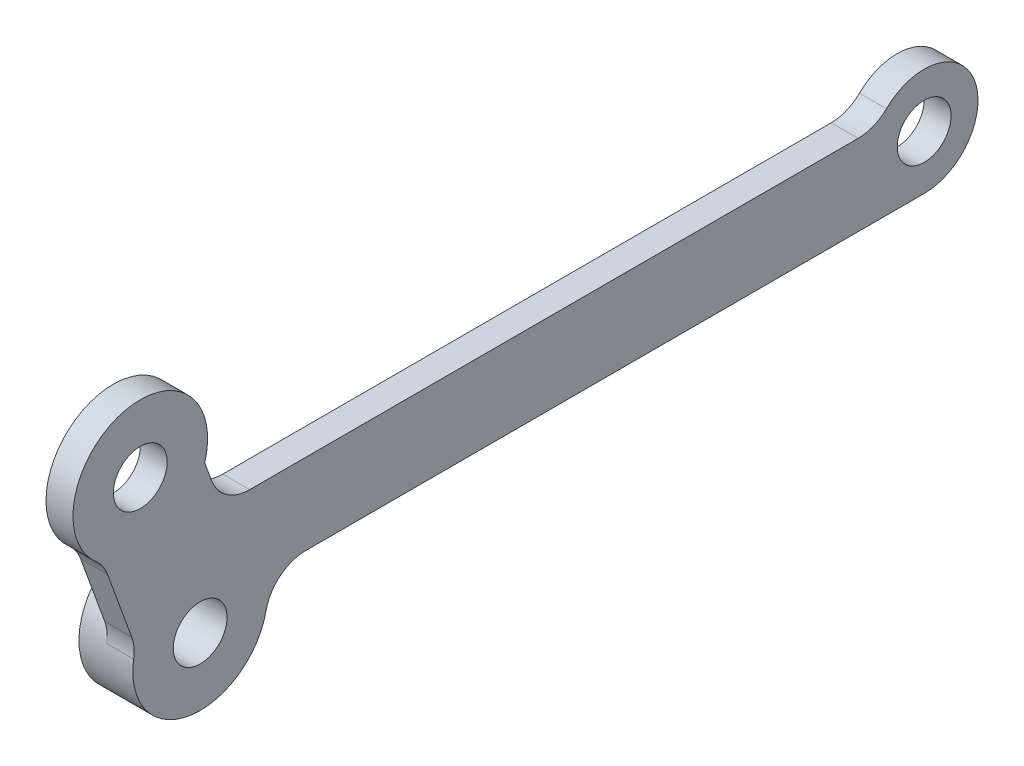
ISO-10303-21;
HEADER;
FILE_DESCRIPTION(('STEP AP214'),'2;1');
FILE_NAME('part.step','',(''),(''),'','','');
FILE_SCHEMA(('AUTOMOTIVE_DESIGN { 1 0 10303 214 1 1 1 1 }'));
ENDSEC;
DATA;
#1=APPLICATION_CONTEXT('core data for automotive mechanical design processes');
#2=APPLICATION_PROTOCOL_DEFINITION('international standard','automotive_design',2000,#1);
#3=PRODUCT_CONTEXT('',#1,'mechanical');
#4=PRODUCT('Part','Part','',(#3));
#5=PRODUCT_RELATED_PRODUCT_CATEGORY('part','',(#4));
#6=PRODUCT_DEFINITION_FORMATION('','',#4);
#7=PRODUCT_DEFINITION_CONTEXT('part definition',#1,'design');
#8=PRODUCT_DEFINITION('design','',#6,#7);
#9=PRODUCT_DEFINITION_SHAPE('','',#8);
#10=(LENGTH_UNIT() NAMED_UNIT(*) SI_UNIT(.MILLI.,.METRE.));
#11=(NAMED_UNIT(*) PLANE_ANGLE_UNIT() SI_UNIT($,.RADIAN.));
#12=(NAMED_UNIT(*) SI_UNIT($,.STERADIAN.) SOLID_ANGLE_UNIT());
#13=UNCERTAINTY_MEASURE_WITH_UNIT(LENGTH_MEASURE(1.E-05),#10,'distance_accuracy_value','');
#14=(GEOMETRIC_REPRESENTATION_CONTEXT(3) GLOBAL_UNCERTAINTY_ASSIGNED_CONTEXT((#13)) GLOBAL_UNIT_ASSIGNED_CONTEXT((#10,
#11,#12)) REPRESENTATION_CONTEXT('',''));
#15=CARTESIAN_POINT('',(0.,0.,0.));
#16=DIRECTION('',(0.,0.,1.));
#17=DIRECTION('',(1.,0.,0.));
#18=AXIS2_PLACEMENT_3D('',#15,#16,#17);
#19=CARTESIAN_POINT('',(2.,0.,0.));
#20=DIRECTION('',(0.,1.,0.));
#21=DIRECTION('',(0.,0.,1.));
#22=AXIS2_PLACEMENT_3D('',#19,#20,#21);
#23=PLANE('',#22);
#24=DIRECTION('',(0.,0.,-1.));
#25=VECTOR('',#24,1.);
#26=CARTESIAN_POINT('',(2.,0.,0.));
#27=LINE('',#26,#25);
#28=CARTESIAN_POINT('',(2.,0.,-2.10062261462914));
#29=VERTEX_POINT('',#28);
#30=CARTESIAN_POINT('',(2.,0.,-47.2848419200309));
#31=VERTEX_POINT('',#30);
#32=EDGE_CURVE('E237',#29,#31,#27,.T.);
#33=ORIENTED_EDGE('',*,*,#32,.T.);
#34=DIRECTION('',(-1.,0.,0.));
#35=VECTOR('',#34,1.);
#36=CARTESIAN_POINT('',(2.,0.,-47.2848419200309));
#37=LINE('',#36,#35);
#38=CARTESIAN_POINT('',(0.,0.,-47.2848419200309));
#39=VERTEX_POINT('',#38);
#40=EDGE_CURVE('E271',#31,#39,#37,.T.);
#41=ORIENTED_EDGE('',*,*,#40,.T.);
#42=DIRECTION('',(0.,0.,-1.));
#43=VECTOR('',#42,1.);
#44=CARTESIAN_POINT('',(0.,0.,0.));
#45=LINE('',#44,#43);
#46=CARTESIAN_POINT('',(0.,0.,-2.10062261462914));
#47=VERTEX_POINT('',#46);
#48=EDGE_CURVE('E267',#47,#39,#45,.T.);
#49=ORIENTED_EDGE('',*,*,#48,.F.);
#50=DIRECTION('',(-1.,0.,0.));
#51=VECTOR('',#50,1.);
#52=CARTESIAN_POINT('',(2.,0.,-2.10062261462914));
#53=LINE('',#52,#51);
#54=EDGE_CURVE('E247',#47,#29,#53,.F.);
#55=ORIENTED_EDGE('',*,*,#54,.T.);
#56=EDGE_LOOP('',(#33,#41,#49,#55));
#57=FACE_BOUND('',#56,.T.);
#58=ADVANCED_FACE('F134',(#57),#23,.T.);
#59=CARTESIAN_POINT('',(2.,-6.,0.));
#60=DIRECTION('',(0.,1.,0.));
#61=DIRECTION('',(0.,0.,1.));
#62=AXIS2_PLACEMENT_3D('',#59,#60,#61);
#63=PLANE('',#62);
#64=DIRECTION('',(0.,0.,-1.));
#65=VECTOR('',#64,1.);
#66=CARTESIAN_POINT('',(2.,-6.,0.));
#67=LINE('',#66,#65);
#68=CARTESIAN_POINT('',(2.,-6.,-6.25683481788682));
#69=VERTEX_POINT('',#68);
#70=CARTESIAN_POINT('',(2.,-6.,-52.1838214055972));
#71=VERTEX_POINT('',#70);
#72=EDGE_CURVE('E223',#69,#71,#67,.T.);
#73=ORIENTED_EDGE('',*,*,#72,.F.);
#74=DIRECTION('',(1.,0.,0.));
#75=VECTOR('',#74,1.);
#76=CARTESIAN_POINT('',(0.,-6.,-6.25683481788682));
#77=LINE('',#76,#75);
#78=CARTESIAN_POINT('',(0.,-6.,-6.25683481788682));
#79=VERTEX_POINT('',#78);
#80=EDGE_CURVE('E294',#69,#79,#77,.F.);
#81=ORIENTED_EDGE('',*,*,#80,.T.);
#82=DIRECTION('',(0.,0.,-1.));
#83=VECTOR('',#82,1.);
#84=CARTESIAN_POINT('',(0.,-6.,0.));
#85=LINE('',#84,#83);
#86=CARTESIAN_POINT('',(0.,-6.,-52.1838214055972));
#87=VERTEX_POINT('',#86);
#88=EDGE_CURVE('E242',#79,#87,#85,.T.);
#89=ORIENTED_EDGE('',*,*,#88,.T.);
#90=DIRECTION('',(-1.,0.,0.));
#91=VECTOR('',#90,1.);
#92=CARTESIAN_POINT('',(2.,-6.,-52.1838214055972));
#93=LINE('',#92,#91);
#94=EDGE_CURVE('E236',#71,#87,#93,.T.);
#95=ORIENTED_EDGE('',*,*,#94,.F.);
#96=EDGE_LOOP('',(#73,#81,#89,#95));
#97=FACE_BOUND('',#96,.T.);
#98=ADVANCED_FACE('F240',(#97),#63,.F.);
#99=CARTESIAN_POINT('',(0.,0.,0.));
#100=DIRECTION('',(1.,0.,0.));
#101=DIRECTION('',(0.,0.,-1.));
#102=AXIS2_PLACEMENT_3D('',#99,#100,#101);
#103=PLANE('',#102);
#104=CARTESIAN_POINT('',(0.,4.84792349691415,6.0212109407801));
#105=DIRECTION('',(1.,0.,0.));
#106=DIRECTION('',(0.,0.,-1.));
#107=AXIS2_PLACEMENT_3D('',#104,#105,#106);
#108=CIRCLE('',#107,2.);
#109=CARTESIAN_POINT('',(0.,4.84792349691415,4.0212109407801));
#110=VERTEX_POINT('',#109);
#111=EDGE_CURVE('E366',#110,#110,#108,.F.);
#112=ORIENTED_EDGE('',*,*,#111,.F.);
#113=EDGE_LOOP('',(#112));
#114=FACE_BOUND('',#113,.T.);
#115=CARTESIAN_POINT('',(0.,-2.,-52.1838214055972));
#116=DIRECTION('',(1.,0.,0.));
#117=DIRECTION('',(0.,0.,-1.));
#118=AXIS2_PLACEMENT_3D('',#115,#116,#117);
#119=CIRCLE('',#118,2.);
#120=CARTESIAN_POINT('',(0.,-2.,-54.1838214055972));
#121=VERTEX_POINT('',#120);
#122=EDGE_CURVE('E373',#121,#121,#119,.F.);
#123=ORIENTED_EDGE('',*,*,#122,.F.);
#124=EDGE_LOOP('',(#123));
#125=FACE_BOUND('',#124,.T.);
#126=ORIENTED_EDGE('',*,*,#88,.F.);
#127=CARTESIAN_POINT('',(0.,-9.,-6.25683481788682));
#128=DIRECTION('',(1.,0.,0.));
#129=DIRECTION('',(0.,0.,-1.));
#130=AXIS2_PLACEMENT_3D('',#127,#128,#129);
#131=CIRCLE('',#130,3.);
#132=CARTESIAN_POINT('',(0.,-8.3880302149885,-3.31991585709935));
#133=VERTEX_POINT('',#132);
#134=EDGE_CURVE('E318',#79,#133,#131,.T.);
#135=ORIENTED_EDGE('',*,*,#134,.T.);
#136=CARTESIAN_POINT('',(0.,-7.36808057330267,1.57494907754644));
#137=DIRECTION('',(1.,0.,0.));
#138=DIRECTION('',(0.,0.,-1.));
#139=AXIS2_PLACEMENT_3D('',#136,#137,#138);
#140=CIRCLE('',#139,4.99999999999999);
#141=CARTESIAN_POINT('',(0.,-6.58978503106634,6.51400324296464));
#142=VERTEX_POINT('',#141);
#143=EDGE_CURVE('E363',#133,#142,#140,.T.);
#144=ORIENTED_EDGE('',*,*,#143,.T.);
#145=CARTESIAN_POINT('',(0.,-6.12280770572454,9.47743574221558));
#146=DIRECTION('',(1.,0.,0.));
#147=DIRECTION('',(0.,0.,-1.));
#148=AXIS2_PLACEMENT_3D('',#145,#146,#147);
#149=CIRCLE('',#148,3.);
#150=CARTESIAN_POINT('',(0.,-5.09674727574754,6.65835787985785));
#151=VERTEX_POINT('',#150);
#152=EDGE_CURVE('E306',#142,#151,#149,.T.);
#153=ORIENTED_EDGE('',*,*,#152,.T.);
#154=DIRECTION('',(0.,-0.939692620785909,-0.342020143325666));
#155=VECTOR('',#154,1.);
#156=CARTESIAN_POINT('',(0.,3.47984292361148,9.77998142392374));
#157=LINE('',#156,#155);
#158=CARTESIAN_POINT('',(0.,-0.159570947246327,8.45534310475597));
#159=VERTEX_POINT('',#158);
#160=EDGE_CURVE('E343',#159,#151,#157,.T.);
#161=ORIENTED_EDGE('',*,*,#160,.F.);
#162=CARTESIAN_POINT('',(0.,-1.18563137722333,11.2744209671137));
#163=DIRECTION('',(1.,0.,0.));
#164=DIRECTION('',(0.,0.,-1.));
#165=AXIS2_PLACEMENT_3D('',#162,#163,#164);
#166=CIRCLE('',#165,3.);
#167=CARTESIAN_POINT('',(0.,1.07695170057823,9.30446720723859));
#168=VERTEX_POINT('',#167);
#169=EDGE_CURVE('E312',#159,#168,#166,.T.);
#170=ORIENTED_EDGE('',*,*,#169,.T.);
#171=CARTESIAN_POINT('',(0.,4.84792349691415,6.0212109407801));
#172=DIRECTION('',(1.,0.,0.));
#173=DIRECTION('',(0.,0.,-1.));
#174=AXIS2_PLACEMENT_3D('',#171,#172,#173);
#175=CIRCLE('',#174,4.99999999999999);
#176=CARTESIAN_POINT('',(0.,3.3969262078591,1.23638002765947));
#177=VERTEX_POINT('',#176);
#178=EDGE_CURVE('E348',#177,#168,#175,.T.);
#179=ORIENTED_EDGE('',*,*,#178,.F.);
#180=DIRECTION('',(0.,-0.939692620785909,-0.342020143325667));
#181=VECTOR('',#180,1.);
#182=CARTESIAN_POINT('',(0.,6.21600407021682,2.26244045763647));
#183=LINE('',#182,#181);
#184=CARTESIAN_POINT('',(0.,1.973939570023,0.71845524772859));
#185=VERTEX_POINT('',#184);
#186=EDGE_CURVE('E258',#177,#185,#183,.T.);
#187=ORIENTED_EDGE('',*,*,#186,.T.);
#188=CARTESIAN_POINT('',(0.,3.,-2.10062261462914));
#189=DIRECTION('',(1.,0.,0.));
#190=DIRECTION('',(0.,0.,-1.));
#191=AXIS2_PLACEMENT_3D('',#188,#189,#190);
#192=CIRCLE('',#191,3.);
#193=EDGE_CURVE('E143',#185,#47,#192,.T.);
#194=ORIENTED_EDGE('',*,*,#193,.T.);
#195=ORIENTED_EDGE('',*,*,#48,.T.);
#196=CARTESIAN_POINT('',(0.,3.,-47.2848419200309));
#197=DIRECTION('',(1.,0.,0.));
#198=DIRECTION('',(0.,0.,-1.));
#199=AXIS2_PLACEMENT_3D('',#196,#197,#198);
#200=CIRCLE('',#199,3.);
#201=CARTESIAN_POINT('',(0.,0.857142857142855,-49.3844045567022));
#202=VERTEX_POINT('',#201);
#203=EDGE_CURVE('E300',#39,#202,#200,.T.);
#204=ORIENTED_EDGE('',*,*,#203,.T.);
#205=CARTESIAN_POINT('',(0.,-2.,-52.1838214055972));
#206=DIRECTION('',(1.,0.,0.));
#207=DIRECTION('',(0.,0.,-1.));
#208=AXIS2_PLACEMENT_3D('',#205,#206,#207);
#209=CIRCLE('',#208,3.99999999999999);
#210=EDGE_CURVE('E254',#87,#202,#209,.T.);
#211=ORIENTED_EDGE('',*,*,#210,.F.);
#212=EDGE_LOOP('',(#126,#135,#144,#153,#161,#170,#179,#187,#194,#195,#204,#211));
#213=FACE_BOUND('',#212,.T.);
#214=ADVANCED_FACE('F328',(#114,#125,#213),#103,.F.);
#215=CARTESIAN_POINT('',(2.,0.,0.));
#216=DIRECTION('',(1.,0.,0.));
#217=DIRECTION('',(0.,0.,-1.));
#218=AXIS2_PLACEMENT_3D('',#215,#216,#217);
#219=PLANE('',#218);
#220=CARTESIAN_POINT('',(2.,4.84792349691415,6.0212109407801));
#221=DIRECTION('',(1.,0.,0.));
#222=DIRECTION('',(0.,0.,-1.));
#223=AXIS2_PLACEMENT_3D('',#220,#221,#222);
#224=CIRCLE('',#223,2.);
#225=CARTESIAN_POINT('',(2.,4.84792349691415,4.0212109407801));
#226=VERTEX_POINT('',#225);
#227=EDGE_CURVE('E377',#226,#226,#224,.T.);
#228=ORIENTED_EDGE('',*,*,#227,.F.);
#229=EDGE_LOOP('',(#228));
#230=FACE_BOUND('',#229,.T.);
#231=CARTESIAN_POINT('',(2.,-7.36808057330267,1.57494907754644));
#232=DIRECTION('',(1.,0.,0.));
#233=DIRECTION('',(0.,0.,-1.));
#234=AXIS2_PLACEMENT_3D('',#231,#232,#233);
#235=CIRCLE('',#234,2.);
#236=CARTESIAN_POINT('',(2.,-7.36808057330267,-0.425050922453565));
#237=VERTEX_POINT('',#236);
#238=EDGE_CURVE('E382',#237,#237,#235,.T.);
#239=ORIENTED_EDGE('',*,*,#238,.F.);
#240=EDGE_LOOP('',(#239));
#241=FACE_BOUND('',#240,.T.);
#242=CARTESIAN_POINT('',(2.,-2.,-52.1838214055972));
#243=DIRECTION('',(1.,0.,0.));
#244=DIRECTION('',(0.,0.,-1.));
#245=AXIS2_PLACEMENT_3D('',#242,#243,#244);
#246=CIRCLE('',#245,2.);
#247=CARTESIAN_POINT('',(2.,-2.,-54.1838214055972));
#248=VERTEX_POINT('',#247);
#249=EDGE_CURVE('E378',#248,#248,#246,.T.);
#250=ORIENTED_EDGE('',*,*,#249,.F.);
#251=EDGE_LOOP('',(#250));
#252=FACE_BOUND('',#251,.T.);
#253=CARTESIAN_POINT('',(2.,-7.36808057330267,1.57494907754644));
#254=DIRECTION('',(1.,0.,0.));
#255=DIRECTION('',(0.,0.,-1.));
#256=AXIS2_PLACEMENT_3D('',#253,#254,#255);
#257=CIRCLE('',#256,4.99999999999999);
#258=CARTESIAN_POINT('',(2.,-6.58978503106634,6.51400324296464));
#259=VERTEX_POINT('',#258);
#260=CARTESIAN_POINT('',(2.,-8.3880302149885,-3.31991585709935));
#261=VERTEX_POINT('',#260);
#262=EDGE_CURVE('E253',#259,#261,#257,.T.);
#263=ORIENTED_EDGE('',*,*,#262,.T.);
#264=CARTESIAN_POINT('',(2.,-9.,-6.25683481788682));
#265=DIRECTION('',(1.,0.,0.));
#266=DIRECTION('',(0.,0.,-1.));
#267=AXIS2_PLACEMENT_3D('',#264,#265,#266);
#268=CIRCLE('',#267,3.);
#269=EDGE_CURVE('E231',#261,#69,#268,.F.);
#270=ORIENTED_EDGE('',*,*,#269,.T.);
#271=ORIENTED_EDGE('',*,*,#72,.T.);
#272=CARTESIAN_POINT('',(2.,-2.,-52.1838214055972));
#273=DIRECTION('',(1.,0.,0.));
#274=DIRECTION('',(0.,0.,-1.));
#275=AXIS2_PLACEMENT_3D('',#272,#273,#274);
#276=CIRCLE('',#275,3.99999999999999);
#277=CARTESIAN_POINT('',(2.,0.857142857142855,-49.3844045567022));
#278=VERTEX_POINT('',#277);
#279=EDGE_CURVE('E228',#71,#278,#276,.T.);
#280=ORIENTED_EDGE('',*,*,#279,.T.);
#281=CARTESIAN_POINT('',(2.,3.,-47.2848419200309));
#282=DIRECTION('',(1.,0.,0.));
#283=DIRECTION('',(0.,0.,-1.));
#284=AXIS2_PLACEMENT_3D('',#281,#282,#283);
#285=CIRCLE('',#284,3.);
#286=EDGE_CURVE('E303',#278,#31,#285,.F.);
#287=ORIENTED_EDGE('',*,*,#286,.T.);
#288=ORIENTED_EDGE('',*,*,#32,.F.);
#289=CARTESIAN_POINT('',(2.,3.,-2.10062261462914));
#290=DIRECTION('',(1.,0.,0.));
#291=DIRECTION('',(0.,0.,-1.));
#292=AXIS2_PLACEMENT_3D('',#289,#290,#291);
#293=CIRCLE('',#292,3.);
#294=CARTESIAN_POINT('',(2.,1.973939570023,0.71845524772859));
#295=VERTEX_POINT('',#294);
#296=EDGE_CURVE('E12',#29,#295,#293,.F.);
#297=ORIENTED_EDGE('',*,*,#296,.T.);
#298=DIRECTION('',(0.,-0.939692620785909,-0.342020143325667));
#299=VECTOR('',#298,1.);
#300=CARTESIAN_POINT('',(2.,6.21600407021682,2.26244045763647));
#301=LINE('',#300,#299);
#302=CARTESIAN_POINT('',(2.,3.3969262078591,1.23638002765947));
#303=VERTEX_POINT('',#302);
#304=EDGE_CURVE('E338',#303,#295,#301,.T.);
#305=ORIENTED_EDGE('',*,*,#304,.F.);
#306=CARTESIAN_POINT('',(2.,4.84792349691415,6.0212109407801));
#307=DIRECTION('',(1.,0.,0.));
#308=DIRECTION('',(0.,0.,-1.));
#309=AXIS2_PLACEMENT_3D('',#306,#307,#308);
#310=CIRCLE('',#309,4.99999999999999);
#311=CARTESIAN_POINT('',(2.,1.07695170057823,9.30446720723859));
#312=VERTEX_POINT('',#311);
#313=EDGE_CURVE('E268',#303,#312,#310,.T.);
#314=ORIENTED_EDGE('',*,*,#313,.T.);
#315=CARTESIAN_POINT('',(2.,-1.18563137722333,11.2744209671137));
#316=DIRECTION('',(1.,0.,0.));
#317=DIRECTION('',(0.,0.,-1.));
#318=AXIS2_PLACEMENT_3D('',#315,#316,#317);
#319=CIRCLE('',#318,3.);
#320=CARTESIAN_POINT('',(2.,-0.159570947246327,8.45534310475597));
#321=VERTEX_POINT('',#320);
#322=EDGE_CURVE('E315',#312,#321,#319,.F.);
#323=ORIENTED_EDGE('',*,*,#322,.T.);
#324=DIRECTION('',(0.,-0.939692620785909,-0.342020143325666));
#325=VECTOR('',#324,1.);
#326=CARTESIAN_POINT('',(2.,3.47984292361148,9.77998142392374));
#327=LINE('',#326,#325);
#328=CARTESIAN_POINT('',(2.,-5.09674727574754,6.65835787985785));
#329=VERTEX_POINT('',#328);
#330=EDGE_CURVE('E342',#321,#329,#327,.T.);
#331=ORIENTED_EDGE('',*,*,#330,.T.);
#332=CARTESIAN_POINT('',(2.,-6.12280770572454,9.47743574221558));
#333=DIRECTION('',(1.,0.,0.));
#334=DIRECTION('',(0.,0.,-1.));
#335=AXIS2_PLACEMENT_3D('',#332,#333,#334);
#336=CIRCLE('',#335,3.);
#337=EDGE_CURVE('E309',#329,#259,#336,.F.);
#338=ORIENTED_EDGE('',*,*,#337,.T.);
#339=EDGE_LOOP('',(#263,#270,#271,#280,#287,#288,#297,#305,#314,#323,#331,#338));
#340=FACE_BOUND('',#339,.T.);
#341=ADVANCED_FACE('F226',(#230,#241,#252,#340),#219,.T.);
#342=CARTESIAN_POINT('',(2.,-2.,-52.1838214055972));
#343=DIRECTION('',(-1.,0.,0.));
#344=DIRECTION('',(0.,0.,1.));
#345=AXIS2_PLACEMENT_3D('',#342,#343,#344);
#346=CYLINDRICAL_SURFACE('',#345,3.99999999999999);
#347=ORIENTED_EDGE('',*,*,#210,.T.);
#348=DIRECTION('',(-1.,0.,0.));
#349=VECTOR('',#348,1.);
#350=CARTESIAN_POINT('',(2.,0.857142857142855,-49.3844045567022));
#351=LINE('',#350,#349);
#352=EDGE_CURVE('E251',#202,#278,#351,.F.);
#353=ORIENTED_EDGE('',*,*,#352,.T.);
#354=ORIENTED_EDGE('',*,*,#279,.F.);
#355=ORIENTED_EDGE('',*,*,#94,.T.);
#356=EDGE_LOOP('',(#347,#353,#354,#355));
#357=FACE_BOUND('',#356,.T.);
#358=ADVANCED_FACE('F249',(#357),#346,.T.);
#359=CARTESIAN_POINT('',(2.,4.84792349691415,6.0212109407801));
#360=DIRECTION('',(-1.,0.,0.));
#361=DIRECTION('',(0.,0.,1.));
#362=AXIS2_PLACEMENT_3D('',#359,#360,#361);
#363=CYLINDRICAL_SURFACE('',#362,4.99999999999999);
#364=ORIENTED_EDGE('',*,*,#178,.T.);
#365=DIRECTION('',(-1.,0.,0.));
#366=VECTOR('',#365,1.);
#367=CARTESIAN_POINT('',(2.,1.07695170057823,9.30446720723859));
#368=LINE('',#367,#366);
#369=EDGE_CURVE('E291',#168,#312,#368,.F.);
#370=ORIENTED_EDGE('',*,*,#369,.T.);
#371=ORIENTED_EDGE('',*,*,#313,.F.);
#372=DIRECTION('',(-1.,0.,0.));
#373=VECTOR('',#372,1.);
#374=CARTESIAN_POINT('',(2.,3.3969262078591,1.23638002765947));
#375=LINE('',#374,#373);
#376=EDGE_CURVE('E264',#303,#177,#375,.T.);
#377=ORIENTED_EDGE('',*,*,#376,.T.);
#378=EDGE_LOOP('',(#364,#370,#371,#377));
#379=FACE_BOUND('',#378,.T.);
#380=ADVANCED_FACE('F424',(#379),#363,.T.);
#381=CARTESIAN_POINT('',(2.,6.21600407021682,2.26244045763647));
#382=DIRECTION('',(0.,0.342020143325667,-0.939692620785909));
#383=DIRECTION('',(0.,0.939692620785909,0.342020143325667));
#384=AXIS2_PLACEMENT_3D('',#381,#382,#383);
#385=PLANE('',#384);
#386=ORIENTED_EDGE('',*,*,#304,.T.);
#387=DIRECTION('',(-1.,0.,0.));
#388=VECTOR('',#387,1.);
#389=CARTESIAN_POINT('',(0.,1.973939570023,0.718455247728589));
#390=LINE('',#389,#388);
#391=EDGE_CURVE('E297',#295,#185,#390,.T.);
#392=ORIENTED_EDGE('',*,*,#391,.T.);
#393=ORIENTED_EDGE('',*,*,#186,.F.);
#394=ORIENTED_EDGE('',*,*,#376,.F.);
#395=EDGE_LOOP('',(#386,#392,#393,#394));
#396=FACE_BOUND('',#395,.T.);
#397=ADVANCED_FACE('F337',(#396),#385,.T.);
#398=CARTESIAN_POINT('',(2.,3.47984292361148,9.77998142392374));
#399=DIRECTION('',(0.,0.342020143325666,-0.939692620785909));
#400=DIRECTION('',(0.,0.93969262078591,0.342020143325666));
#401=AXIS2_PLACEMENT_3D('',#398,#399,#400);
#402=PLANE('',#401);
#403=ORIENTED_EDGE('',*,*,#160,.T.);
#404=DIRECTION('',(1.,0.,0.));
#405=VECTOR('',#404,1.);
#406=CARTESIAN_POINT('',(2.,-5.09674727574754,6.65835787985785));
#407=LINE('',#406,#405);
#408=EDGE_CURVE('E288',#151,#329,#407,.T.);
#409=ORIENTED_EDGE('',*,*,#408,.T.);
#410=ORIENTED_EDGE('',*,*,#330,.F.);
#411=DIRECTION('',(1.,0.,0.));
#412=VECTOR('',#411,1.);
#413=CARTESIAN_POINT('',(0.,-0.159570947246327,8.45534310475597));
#414=LINE('',#413,#412);
#415=EDGE_CURVE('E284',#321,#159,#414,.F.);
#416=ORIENTED_EDGE('',*,*,#415,.T.);
#417=EDGE_LOOP('',(#403,#409,#410,#416));
#418=FACE_BOUND('',#417,.T.);
#419=ADVANCED_FACE('F428',(#418),#402,.F.);
#420=CARTESIAN_POINT('',(2.,-7.36808057330267,1.57494907754644));
#421=DIRECTION('',(-1.,0.,0.));
#422=DIRECTION('',(0.,0.,1.));
#423=AXIS2_PLACEMENT_3D('',#420,#421,#422);
#424=CYLINDRICAL_SURFACE('',#423,4.99999999999999);
#425=ORIENTED_EDGE('',*,*,#262,.F.);
#426=DIRECTION('',(-1.,0.,0.));
#427=VECTOR('',#426,1.);
#428=CARTESIAN_POINT('',(2.,-6.58978503106634,6.51400324296465));
#429=LINE('',#428,#427);
#430=EDGE_CURVE('E280',#259,#142,#429,.T.);
#431=ORIENTED_EDGE('',*,*,#430,.T.);
#432=ORIENTED_EDGE('',*,*,#143,.F.);
#433=DIRECTION('',(-1.,0.,0.));
#434=VECTOR('',#433,1.);
#435=CARTESIAN_POINT('',(2.,-8.3880302149885,-3.31991585709935));
#436=LINE('',#435,#434);
#437=EDGE_CURVE('E277',#133,#261,#436,.F.);
#438=ORIENTED_EDGE('',*,*,#437,.T.);
#439=EDGE_LOOP('',(#425,#431,#432,#438));
#440=FACE_BOUND('',#439,.T.);
#441=CARTESIAN_POINT('',(-2.,-7.36808057330267,1.57494907754644));
#442=DIRECTION('',(1.,0.,0.));
#443=DIRECTION('',(0.,0.,-1.));
#444=AXIS2_PLACEMENT_3D('',#441,#442,#443);
#445=CIRCLE('',#444,4.99999999999999);
#446=CARTESIAN_POINT('',(-2.,-7.36808057330267,-3.42505092245356));
#447=VERTEX_POINT('',#446);
#448=EDGE_CURVE('E260',#447,#447,#445,.T.);
#449=ORIENTED_EDGE('',*,*,#448,.T.);
#450=EDGE_LOOP('',(#449));
#451=FACE_BOUND('',#450,.T.);
#452=ADVANCED_FACE('F431',(#440,#451),#424,.T.);
#453=CARTESIAN_POINT('',(-2.,-7.36808057330267,1.57494907754644));
#454=DIRECTION('',(1.,0.,0.));
#455=DIRECTION('',(0.,0.,-1.));
#456=AXIS2_PLACEMENT_3D('',#453,#454,#455);
#457=PLANE('',#456);
#458=CARTESIAN_POINT('',(-2.,-7.36808057330267,1.57494907754644));
#459=DIRECTION('',(1.,0.,0.));
#460=DIRECTION('',(0.,0.,-1.));
#461=AXIS2_PLACEMENT_3D('',#458,#459,#460);
#462=CIRCLE('',#461,2.);
#463=CARTESIAN_POINT('',(-2.,-7.36808057330267,-0.425050922453565));
#464=VERTEX_POINT('',#463);
#465=EDGE_CURVE('E383',#464,#464,#462,.T.);
#466=ORIENTED_EDGE('',*,*,#465,.T.);
#467=EDGE_LOOP('',(#466));
#468=FACE_BOUND('',#467,.T.);
#469=ORIENTED_EDGE('',*,*,#448,.F.);
#470=EDGE_LOOP('',(#469));
#471=FACE_BOUND('',#470,.T.);
#472=ADVANCED_FACE('F437',(#468,#471),#457,.F.);
#473=CARTESIAN_POINT('',(2.,-7.36808057330267,1.57494907754644));
#474=DIRECTION('',(-1.,0.,0.));
#475=DIRECTION('',(0.,0.,1.));
#476=AXIS2_PLACEMENT_3D('',#473,#474,#475);
#477=CYLINDRICAL_SURFACE('',#476,2.);
#478=ORIENTED_EDGE('',*,*,#238,.T.);
#479=EDGE_LOOP('',(#478));
#480=FACE_BOUND('',#479,.T.);
#481=ORIENTED_EDGE('',*,*,#465,.F.);
#482=EDGE_LOOP('',(#481));
#483=FACE_BOUND('',#482,.T.);
#484=ADVANCED_FACE('F407',(#480,#483),#477,.F.);
#485=CARTESIAN_POINT('',(2.,-2.,-52.1838214055972));
#486=DIRECTION('',(-1.,0.,0.));
#487=DIRECTION('',(0.,0.,1.));
#488=AXIS2_PLACEMENT_3D('',#485,#486,#487);
#489=CYLINDRICAL_SURFACE('',#488,2.);
#490=ORIENTED_EDGE('',*,*,#249,.T.);
#491=EDGE_LOOP('',(#490));
#492=FACE_BOUND('',#491,.T.);
#493=ORIENTED_EDGE('',*,*,#122,.T.);
#494=EDGE_LOOP('',(#493));
#495=FACE_BOUND('',#494,.T.);
#496=ADVANCED_FACE('F404',(#492,#495),#489,.F.);
#497=CARTESIAN_POINT('',(2.,4.84792349691415,6.0212109407801));
#498=DIRECTION('',(-1.,0.,0.));
#499=DIRECTION('',(0.,0.,1.));
#500=AXIS2_PLACEMENT_3D('',#497,#498,#499);
#501=CYLINDRICAL_SURFACE('',#500,2.);
#502=ORIENTED_EDGE('',*,*,#227,.T.);
#503=EDGE_LOOP('',(#502));
#504=FACE_BOUND('',#503,.T.);
#505=ORIENTED_EDGE('',*,*,#111,.T.);
#506=EDGE_LOOP('',(#505));
#507=FACE_BOUND('',#506,.T.);
#508=ADVANCED_FACE('F394',(#504,#507),#501,.F.);
#509=CARTESIAN_POINT('',(2.,3.,-47.2848419200309));
#510=DIRECTION('',(-1.,0.,0.));
#511=DIRECTION('',(0.,0.,1.));
#512=AXIS2_PLACEMENT_3D('',#509,#510,#511);
#513=CYLINDRICAL_SURFACE('',#512,3.);
#514=ORIENTED_EDGE('',*,*,#286,.F.);
#515=ORIENTED_EDGE('',*,*,#352,.F.);
#516=ORIENTED_EDGE('',*,*,#203,.F.);
#517=ORIENTED_EDGE('',*,*,#40,.F.);
#518=EDGE_LOOP('',(#514,#515,#516,#517));
#519=FACE_BOUND('',#518,.T.);
#520=ADVANCED_FACE('F441',(#519),#513,.F.);
#521=CARTESIAN_POINT('',(2.,-6.12280770572454,9.47743574221558));
#522=DIRECTION('',(-1.,0.,0.));
#523=DIRECTION('',(0.,0.,1.));
#524=AXIS2_PLACEMENT_3D('',#521,#522,#523);
#525=CYLINDRICAL_SURFACE('',#524,3.);
#526=ORIENTED_EDGE('',*,*,#337,.F.);
#527=ORIENTED_EDGE('',*,*,#408,.F.);
#528=ORIENTED_EDGE('',*,*,#152,.F.);
#529=ORIENTED_EDGE('',*,*,#430,.F.);
#530=EDGE_LOOP('',(#526,#527,#528,#529));
#531=FACE_BOUND('',#530,.T.);
#532=ADVANCED_FACE('F444',(#531),#525,.F.);
#533=CARTESIAN_POINT('',(2.,-1.18563137722333,11.2744209671137));
#534=DIRECTION('',(-1.,0.,0.));
#535=DIRECTION('',(0.,0.,1.));
#536=AXIS2_PLACEMENT_3D('',#533,#534,#535);
#537=CYLINDRICAL_SURFACE('',#536,3.);
#538=ORIENTED_EDGE('',*,*,#322,.F.);
#539=ORIENTED_EDGE('',*,*,#369,.F.);
#540=ORIENTED_EDGE('',*,*,#169,.F.);
#541=ORIENTED_EDGE('',*,*,#415,.F.);
#542=EDGE_LOOP('',(#538,#539,#540,#541));
#543=FACE_BOUND('',#542,.T.);
#544=ADVANCED_FACE('F448',(#543),#537,.F.);
#545=CARTESIAN_POINT('',(2.,-9.,-6.25683481788682));
#546=DIRECTION('',(-1.,0.,0.));
#547=DIRECTION('',(0.,0.,1.));
#548=AXIS2_PLACEMENT_3D('',#545,#546,#547);
#549=CYLINDRICAL_SURFACE('',#548,3.);
#550=ORIENTED_EDGE('',*,*,#269,.F.);
#551=ORIENTED_EDGE('',*,*,#437,.F.);
#552=ORIENTED_EDGE('',*,*,#134,.F.);
#553=ORIENTED_EDGE('',*,*,#80,.F.);
#554=EDGE_LOOP('',(#550,#551,#552,#553));
#555=FACE_BOUND('',#554,.T.);
#556=ADVANCED_FACE('F451',(#555),#549,.F.);
#557=CARTESIAN_POINT('',(2.,3.,-2.10062261462914));
#558=DIRECTION('',(1.,0.,0.));
#559=DIRECTION('',(0.,0.,-1.));
#560=AXIS2_PLACEMENT_3D('',#557,#558,#559);
#561=CYLINDRICAL_SURFACE('',#560,3.);
#562=ORIENTED_EDGE('',*,*,#296,.F.);
#563=ORIENTED_EDGE('',*,*,#54,.F.);
#564=ORIENTED_EDGE('',*,*,#193,.F.);
#565=ORIENTED_EDGE('',*,*,#391,.F.);
#566=EDGE_LOOP('',(#562,#563,#564,#565));
#567=FACE_BOUND('',#566,.T.);
#568=ADVANCED_FACE('F136',(#567),#561,.F.);
#569=CLOSED_SHELL('',(#58,#98,#214,#341,#358,#380,#397,#419,#452,#472,#484,#496,#508,#520,#532,
#544,#556,#568));
#570=MANIFOLD_SOLID_BREP('B2',#569);
#571=ADVANCED_BREP_SHAPE_REPRESENTATION('',(#18,#570),#14);
#572=SHAPE_DEFINITION_REPRESENTATION(#9,#571);
ENDSEC;
END-ISO-10303-21;
